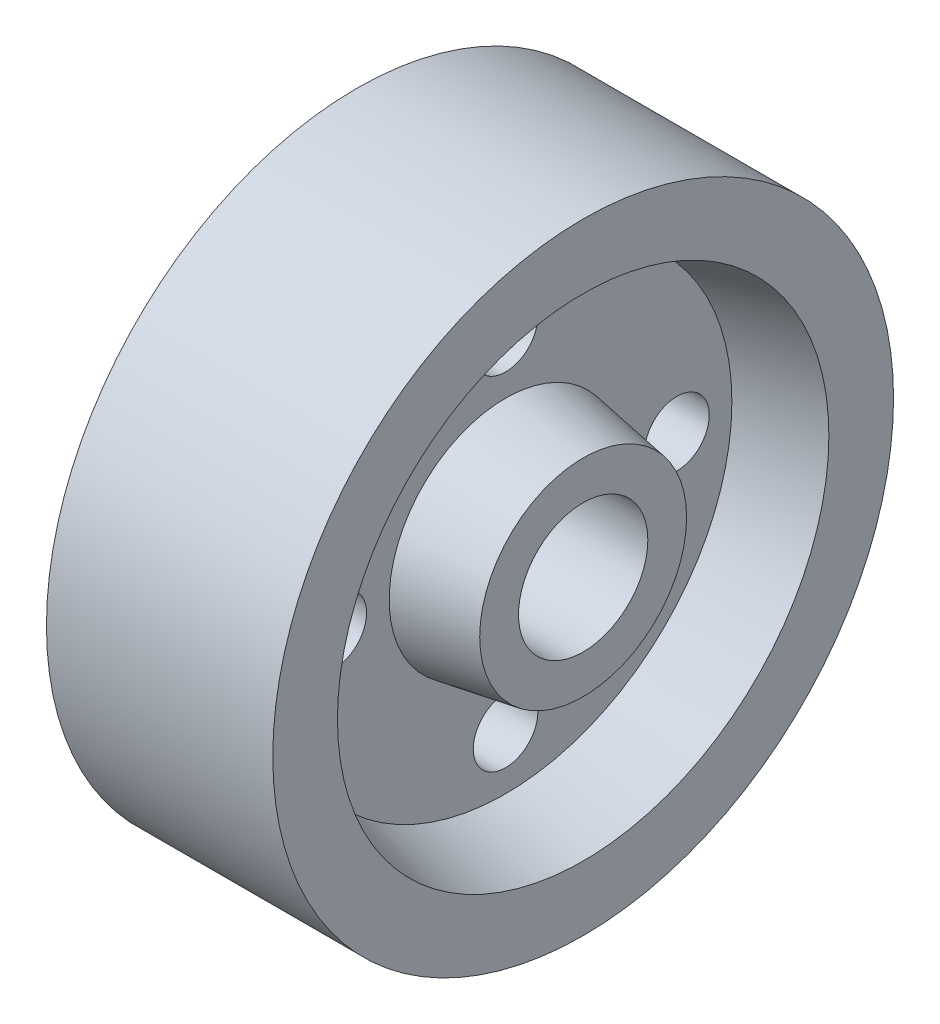
ISO-10303-21;
HEADER;
FILE_DESCRIPTION(('STEP AP214'),'2;1');
FILE_NAME('part.step','',(''),(''),'','','');
FILE_SCHEMA(('AUTOMOTIVE_DESIGN { 1 0 10303 214 1 1 1 1 }'));
ENDSEC;
DATA;
#1=APPLICATION_CONTEXT('core data for automotive mechanical design processes');
#2=APPLICATION_PROTOCOL_DEFINITION('international standard','automotive_design',2000,#1);
#3=PRODUCT_CONTEXT('',#1,'mechanical');
#4=PRODUCT('Part','Part','',(#3));
#5=PRODUCT_RELATED_PRODUCT_CATEGORY('part','',(#4));
#6=PRODUCT_DEFINITION_FORMATION('','',#4);
#7=PRODUCT_DEFINITION_CONTEXT('part definition',#1,'design');
#8=PRODUCT_DEFINITION('design','',#6,#7);
#9=PRODUCT_DEFINITION_SHAPE('','',#8);
#10=(LENGTH_UNIT() NAMED_UNIT(*) SI_UNIT(.MILLI.,.METRE.));
#11=(NAMED_UNIT(*) PLANE_ANGLE_UNIT() SI_UNIT($,.RADIAN.));
#12=(NAMED_UNIT(*) SI_UNIT($,.STERADIAN.) SOLID_ANGLE_UNIT());
#13=UNCERTAINTY_MEASURE_WITH_UNIT(LENGTH_MEASURE(1.E-05),#10,'distance_accuracy_value','');
#14=(GEOMETRIC_REPRESENTATION_CONTEXT(3) GLOBAL_UNCERTAINTY_ASSIGNED_CONTEXT((#13)) GLOBAL_UNIT_ASSIGNED_CONTEXT((#10,
#11,#12)) REPRESENTATION_CONTEXT('',''));
#15=CARTESIAN_POINT('',(0.,0.,0.));
#16=DIRECTION('',(0.,0.,1.));
#17=DIRECTION('',(1.,0.,0.));
#18=AXIS2_PLACEMENT_3D('',#15,#16,#17);
#19=CARTESIAN_POINT('',(-12.,10.,0.));
#20=DIRECTION('',(-1.,0.,0.));
#21=DIRECTION('',(0.,0.,1.));
#22=AXIS2_PLACEMENT_3D('',#19,#20,#21);
#23=PLANE('',#22);
#24=CARTESIAN_POINT('',(-12.,0.,0.));
#25=DIRECTION('',(1.,0.,0.));
#26=DIRECTION('',(0.,0.,-1.));
#27=AXIS2_PLACEMENT_3D('',#24,#25,#26);
#28=CIRCLE('',#27,10.);
#29=CARTESIAN_POINT('',(-12.,0.,-10.));
#30=VERTEX_POINT('',#29);
#31=EDGE_CURVE('E10',#30,#30,#28,.T.);
#32=ORIENTED_EDGE('',*,*,#31,.T.);
#33=EDGE_LOOP('',(#32));
#34=FACE_BOUND('',#33,.T.);
#35=CARTESIAN_POINT('',(-12.,0.,0.));
#36=DIRECTION('',(1.,0.,0.));
#37=DIRECTION('',(0.,0.,-1.));
#38=AXIS2_PLACEMENT_3D('',#35,#36,#37);
#39=CIRCLE('',#38,16.);
#40=CARTESIAN_POINT('',(-12.,0.,-16.));
#41=VERTEX_POINT('',#40);
#42=EDGE_CURVE('E51',#41,#41,#39,.T.);
#43=ORIENTED_EDGE('',*,*,#42,.F.);
#44=EDGE_LOOP('',(#43));
#45=FACE_BOUND('',#44,.T.);
#46=ADVANCED_FACE('F43',(#34,#45),#23,.T.);
#47=CARTESIAN_POINT('',(0.,0.,0.));
#48=DIRECTION('',(1.,0.,0.));
#49=DIRECTION('',(0.,0.,-1.));
#50=AXIS2_PLACEMENT_3D('',#47,#48,#49);
#51=CONICAL_SURFACE('',#50,18.,0.165148677414627);
#52=ORIENTED_EDGE('',*,*,#42,.T.);
#53=EDGE_LOOP('',(#52));
#54=FACE_BOUND('',#53,.T.);
#55=CARTESIAN_POINT('',(0.,0.,0.));
#56=DIRECTION('',(1.,0.,0.));
#57=DIRECTION('',(0.,0.,-1.));
#58=AXIS2_PLACEMENT_3D('',#55,#56,#57);
#59=CIRCLE('',#58,18.);
#60=CARTESIAN_POINT('',(0.,0.,-18.));
#61=VERTEX_POINT('',#60);
#62=EDGE_CURVE('E57',#61,#61,#59,.T.);
#63=ORIENTED_EDGE('',*,*,#62,.F.);
#64=EDGE_LOOP('',(#63));
#65=FACE_BOUND('',#64,.T.);
#66=ADVANCED_FACE('F132',(#54,#65),#51,.T.);
#67=CARTESIAN_POINT('',(0.,18.,0.));
#68=DIRECTION('',(-1.,0.,0.));
#69=DIRECTION('',(0.,0.,1.));
#70=AXIS2_PLACEMENT_3D('',#67,#68,#69);
#71=PLANE('',#70);
#72=CARTESIAN_POINT('',(0.,26.5,0.));
#73=DIRECTION('',(-1.,0.,0.));
#74=DIRECTION('',(0.,0.,1.));
#75=AXIS2_PLACEMENT_3D('',#72,#73,#74);
#76=CIRCLE('',#75,5.);
#77=CARTESIAN_POINT('',(0.,26.5,5.));
#78=VERTEX_POINT('',#77);
#79=EDGE_CURVE('E86',#78,#78,#76,.T.);
#80=ORIENTED_EDGE('',*,*,#79,.F.);
#81=EDGE_LOOP('',(#80));
#82=FACE_BOUND('',#81,.T.);
#83=CARTESIAN_POINT('',(0.,0.,26.5));
#84=DIRECTION('',(-1.,0.,0.));
#85=DIRECTION('',(0.,0.,1.));
#86=AXIS2_PLACEMENT_3D('',#83,#84,#85);
#87=CIRCLE('',#86,5.);
#88=CARTESIAN_POINT('',(0.,0.,31.5));
#89=VERTEX_POINT('',#88);
#90=EDGE_CURVE('E73',#89,#89,#87,.T.);
#91=ORIENTED_EDGE('',*,*,#90,.F.);
#92=EDGE_LOOP('',(#91));
#93=FACE_BOUND('',#92,.T.);
#94=CARTESIAN_POINT('',(0.,-26.5,-1.85048510958686E-13));
#95=DIRECTION('',(-1.,0.,0.));
#96=DIRECTION('',(0.,0.,1.));
#97=AXIS2_PLACEMENT_3D('',#94,#95,#96);
#98=CIRCLE('',#97,5.);
#99=CARTESIAN_POINT('',(0.,-26.5,4.99999999999982));
#100=VERTEX_POINT('',#99);
#101=EDGE_CURVE('E69',#100,#100,#98,.T.);
#102=ORIENTED_EDGE('',*,*,#101,.F.);
#103=EDGE_LOOP('',(#102));
#104=FACE_BOUND('',#103,.T.);
#105=CARTESIAN_POINT('',(0.,2.77572766438029E-13,-26.5));
#106=DIRECTION('',(-1.,0.,0.));
#107=DIRECTION('',(0.,0.,1.));
#108=AXIS2_PLACEMENT_3D('',#105,#106,#107);
#109=CIRCLE('',#108,5.);
#110=CARTESIAN_POINT('',(0.,2.77572766438029E-13,-21.5));
#111=VERTEX_POINT('',#110);
#112=EDGE_CURVE('E65',#111,#111,#109,.T.);
#113=ORIENTED_EDGE('',*,*,#112,.F.);
#114=EDGE_LOOP('',(#113));
#115=FACE_BOUND('',#114,.T.);
#116=ORIENTED_EDGE('',*,*,#62,.T.);
#117=EDGE_LOOP('',(#116));
#118=FACE_BOUND('',#117,.T.);
#119=CARTESIAN_POINT('',(0.,0.,0.));
#120=DIRECTION('',(1.,0.,0.));
#121=DIRECTION('',(0.,0.,-1.));
#122=AXIS2_PLACEMENT_3D('',#119,#120,#121);
#123=CIRCLE('',#122,35.);
#124=CARTESIAN_POINT('',(0.,0.,-35.));
#125=VERTEX_POINT('',#124);
#126=EDGE_CURVE('E122',#125,#125,#123,.T.);
#127=ORIENTED_EDGE('',*,*,#126,.F.);
#128=EDGE_LOOP('',(#127));
#129=FACE_BOUND('',#128,.T.);
#130=ADVANCED_FACE('F129',(#82,#93,#104,#115,#118,#129),#71,.T.);
#131=CARTESIAN_POINT('',(-12.,0.,0.));
#132=DIRECTION('',(-1.,0.,0.));
#133=DIRECTION('',(0.,0.,1.));
#134=AXIS2_PLACEMENT_3D('',#131,#132,#133);
#135=CONICAL_SURFACE('',#134,38.,0.244978663126863);
#136=ORIENTED_EDGE('',*,*,#126,.T.);
#137=EDGE_LOOP('',(#136));
#138=FACE_BOUND('',#137,.T.);
#139=CARTESIAN_POINT('',(-12.,0.,0.));
#140=DIRECTION('',(1.,0.,0.));
#141=DIRECTION('',(0.,0.,-1.));
#142=AXIS2_PLACEMENT_3D('',#139,#140,#141);
#143=CIRCLE('',#142,38.);
#144=CARTESIAN_POINT('',(-12.,0.,-38.));
#145=VERTEX_POINT('',#144);
#146=EDGE_CURVE('E118',#145,#145,#143,.T.);
#147=ORIENTED_EDGE('',*,*,#146,.F.);
#148=EDGE_LOOP('',(#147));
#149=FACE_BOUND('',#148,.T.);
#150=ADVANCED_FACE('F140',(#138,#149),#135,.F.);
#151=CARTESIAN_POINT('',(-12.,38.,0.));
#152=DIRECTION('',(-1.,0.,0.));
#153=DIRECTION('',(0.,0.,1.));
#154=AXIS2_PLACEMENT_3D('',#151,#152,#153);
#155=PLANE('',#154);
#156=ORIENTED_EDGE('',*,*,#146,.T.);
#157=EDGE_LOOP('',(#156));
#158=FACE_BOUND('',#157,.T.);
#159=CARTESIAN_POINT('',(-12.,0.,0.));
#160=DIRECTION('',(1.,0.,0.));
#161=DIRECTION('',(0.,0.,-1.));
#162=AXIS2_PLACEMENT_3D('',#159,#160,#161);
#163=CIRCLE('',#162,48.);
#164=CARTESIAN_POINT('',(-12.,0.,-48.));
#165=VERTEX_POINT('',#164);
#166=EDGE_CURVE('E114',#165,#165,#163,.T.);
#167=ORIENTED_EDGE('',*,*,#166,.F.);
#168=EDGE_LOOP('',(#167));
#169=FACE_BOUND('',#168,.T.);
#170=ADVANCED_FACE('F145',(#158,#169),#155,.T.);
#171=CARTESIAN_POINT('',(11.,0.,0.));
#172=DIRECTION('',(1.,0.,0.));
#173=DIRECTION('',(0.,0.,-1.));
#174=AXIS2_PLACEMENT_3D('',#171,#172,#173);
#175=CYLINDRICAL_SURFACE('',#174,48.);
#176=ORIENTED_EDGE('',*,*,#166,.T.);
#177=EDGE_LOOP('',(#176));
#178=FACE_BOUND('',#177,.T.);
#179=CARTESIAN_POINT('',(23.,0.,0.));
#180=DIRECTION('',(1.,0.,0.));
#181=DIRECTION('',(0.,0.,-1.));
#182=AXIS2_PLACEMENT_3D('',#179,#180,#181);
#183=CIRCLE('',#182,48.);
#184=CARTESIAN_POINT('',(23.,0.,-48.));
#185=VERTEX_POINT('',#184);
#186=EDGE_CURVE('E110',#185,#185,#183,.T.);
#187=ORIENTED_EDGE('',*,*,#186,.F.);
#188=EDGE_LOOP('',(#187));
#189=FACE_BOUND('',#188,.T.);
#190=ADVANCED_FACE('F149',(#178,#189),#175,.T.);
#191=CARTESIAN_POINT('',(23.,48.,0.));
#192=DIRECTION('',(1.,0.,0.));
#193=DIRECTION('',(0.,0.,-1.));
#194=AXIS2_PLACEMENT_3D('',#191,#192,#193);
#195=PLANE('',#194);
#196=ORIENTED_EDGE('',*,*,#186,.T.);
#197=EDGE_LOOP('',(#196));
#198=FACE_BOUND('',#197,.T.);
#199=CARTESIAN_POINT('',(23.,0.,0.));
#200=DIRECTION('',(1.,0.,0.));
#201=DIRECTION('',(0.,0.,-1.));
#202=AXIS2_PLACEMENT_3D('',#199,#200,#201);
#203=CIRCLE('',#202,38.);
#204=CARTESIAN_POINT('',(23.,0.,-38.));
#205=VERTEX_POINT('',#204);
#206=EDGE_CURVE('E106',#205,#205,#203,.T.);
#207=ORIENTED_EDGE('',*,*,#206,.F.);
#208=EDGE_LOOP('',(#207));
#209=FACE_BOUND('',#208,.T.);
#210=ADVANCED_FACE('F153',(#198,#209),#195,.T.);
#211=CARTESIAN_POINT('',(11.,0.,0.));
#212=DIRECTION('',(1.,0.,0.));
#213=DIRECTION('',(0.,0.,-1.));
#214=AXIS2_PLACEMENT_3D('',#211,#212,#213);
#215=CONICAL_SURFACE('',#214,35.,0.244978663126863);
#216=ORIENTED_EDGE('',*,*,#206,.T.);
#217=EDGE_LOOP('',(#216));
#218=FACE_BOUND('',#217,.T.);
#219=CARTESIAN_POINT('',(11.,0.,0.));
#220=DIRECTION('',(1.,0.,0.));
#221=DIRECTION('',(0.,0.,-1.));
#222=AXIS2_PLACEMENT_3D('',#219,#220,#221);
#223=CIRCLE('',#222,35.);
#224=CARTESIAN_POINT('',(11.,0.,-35.));
#225=VERTEX_POINT('',#224);
#226=EDGE_CURVE('E102',#225,#225,#223,.T.);
#227=ORIENTED_EDGE('',*,*,#226,.F.);
#228=EDGE_LOOP('',(#227));
#229=FACE_BOUND('',#228,.T.);
#230=ADVANCED_FACE('F157',(#218,#229),#215,.F.);
#231=CARTESIAN_POINT('',(11.,35.,0.));
#232=DIRECTION('',(1.,0.,0.));
#233=DIRECTION('',(0.,0.,-1.));
#234=AXIS2_PLACEMENT_3D('',#231,#232,#233);
#235=PLANE('',#234);
#236=CARTESIAN_POINT('',(11.,26.5,0.));
#237=DIRECTION('',(1.,0.,0.));
#238=DIRECTION('',(0.,0.,-1.));
#239=AXIS2_PLACEMENT_3D('',#236,#237,#238);
#240=CIRCLE('',#239,5.);
#241=CARTESIAN_POINT('',(11.,26.5,-5.));
#242=VERTEX_POINT('',#241);
#243=EDGE_CURVE('E46',#242,#242,#240,.T.);
#244=ORIENTED_EDGE('',*,*,#243,.F.);
#245=EDGE_LOOP('',(#244));
#246=FACE_BOUND('',#245,.T.);
#247=CARTESIAN_POINT('',(11.,0.,26.5));
#248=DIRECTION('',(1.,0.,0.));
#249=DIRECTION('',(0.,0.,-1.));
#250=AXIS2_PLACEMENT_3D('',#247,#248,#249);
#251=CIRCLE('',#250,5.);
#252=CARTESIAN_POINT('',(11.,0.,21.5));
#253=VERTEX_POINT('',#252);
#254=EDGE_CURVE('E70',#253,#253,#251,.T.);
#255=ORIENTED_EDGE('',*,*,#254,.F.);
#256=EDGE_LOOP('',(#255));
#257=FACE_BOUND('',#256,.T.);
#258=CARTESIAN_POINT('',(11.,-26.5,-1.85048510958686E-13));
#259=DIRECTION('',(1.,0.,0.));
#260=DIRECTION('',(0.,0.,-1.));
#261=AXIS2_PLACEMENT_3D('',#258,#259,#260);
#262=CIRCLE('',#261,5.);
#263=CARTESIAN_POINT('',(11.,-26.5,-5.00000000000019));
#264=VERTEX_POINT('',#263);
#265=EDGE_CURVE('E66',#264,#264,#262,.T.);
#266=ORIENTED_EDGE('',*,*,#265,.F.);
#267=EDGE_LOOP('',(#266));
#268=FACE_BOUND('',#267,.T.);
#269=CARTESIAN_POINT('',(11.,2.77572766438029E-13,-26.5));
#270=DIRECTION('',(1.,0.,0.));
#271=DIRECTION('',(0.,0.,-1.));
#272=AXIS2_PLACEMENT_3D('',#269,#270,#271);
#273=CIRCLE('',#272,5.);
#274=CARTESIAN_POINT('',(11.,2.77572766438029E-13,-31.5));
#275=VERTEX_POINT('',#274);
#276=EDGE_CURVE('E61',#275,#275,#273,.T.);
#277=ORIENTED_EDGE('',*,*,#276,.F.);
#278=EDGE_LOOP('',(#277));
#279=FACE_BOUND('',#278,.T.);
#280=ORIENTED_EDGE('',*,*,#226,.T.);
#281=EDGE_LOOP('',(#280));
#282=FACE_BOUND('',#281,.T.);
#283=CARTESIAN_POINT('',(11.,0.,0.));
#284=DIRECTION('',(1.,0.,0.));
#285=DIRECTION('',(0.,0.,-1.));
#286=AXIS2_PLACEMENT_3D('',#283,#284,#285);
#287=CIRCLE('',#286,18.);
#288=CARTESIAN_POINT('',(11.,0.,-18.));
#289=VERTEX_POINT('',#288);
#290=EDGE_CURVE('E98',#289,#289,#287,.T.);
#291=ORIENTED_EDGE('',*,*,#290,.F.);
#292=EDGE_LOOP('',(#291));
#293=FACE_BOUND('',#292,.T.);
#294=ADVANCED_FACE('F161',(#246,#257,#268,#279,#282,#293),#235,.T.);
#295=CARTESIAN_POINT('',(23.,0.,0.));
#296=DIRECTION('',(-1.,0.,0.));
#297=DIRECTION('',(0.,0.,1.));
#298=AXIS2_PLACEMENT_3D('',#295,#296,#297);
#299=CONICAL_SURFACE('',#298,16.,0.165148677414627);
#300=ORIENTED_EDGE('',*,*,#290,.T.);
#301=EDGE_LOOP('',(#300));
#302=FACE_BOUND('',#301,.T.);
#303=CARTESIAN_POINT('',(23.,0.,0.));
#304=DIRECTION('',(1.,0.,0.));
#305=DIRECTION('',(0.,0.,-1.));
#306=AXIS2_PLACEMENT_3D('',#303,#304,#305);
#307=CIRCLE('',#306,16.);
#308=CARTESIAN_POINT('',(23.,0.,-16.));
#309=VERTEX_POINT('',#308);
#310=EDGE_CURVE('E94',#309,#309,#307,.T.);
#311=ORIENTED_EDGE('',*,*,#310,.F.);
#312=EDGE_LOOP('',(#311));
#313=FACE_BOUND('',#312,.T.);
#314=ADVANCED_FACE('F165',(#302,#313),#299,.T.);
#315=CARTESIAN_POINT('',(23.,10.,0.));
#316=DIRECTION('',(1.,0.,0.));
#317=DIRECTION('',(0.,0.,-1.));
#318=AXIS2_PLACEMENT_3D('',#315,#316,#317);
#319=PLANE('',#318);
#320=ORIENTED_EDGE('',*,*,#310,.T.);
#321=EDGE_LOOP('',(#320));
#322=FACE_BOUND('',#321,.T.);
#323=CARTESIAN_POINT('',(23.,0.,0.));
#324=DIRECTION('',(1.,0.,0.));
#325=DIRECTION('',(0.,0.,-1.));
#326=AXIS2_PLACEMENT_3D('',#323,#324,#325);
#327=CIRCLE('',#326,10.);
#328=CARTESIAN_POINT('',(23.,0.,-10.));
#329=VERTEX_POINT('',#328);
#330=EDGE_CURVE('E90',#329,#329,#327,.T.);
#331=ORIENTED_EDGE('',*,*,#330,.F.);
#332=EDGE_LOOP('',(#331));
#333=FACE_BOUND('',#332,.T.);
#334=ADVANCED_FACE('F169',(#322,#333),#319,.T.);
#335=CARTESIAN_POINT('',(11.,0.,0.));
#336=DIRECTION('',(1.,0.,0.));
#337=DIRECTION('',(0.,0.,-1.));
#338=AXIS2_PLACEMENT_3D('',#335,#336,#337);
#339=CYLINDRICAL_SURFACE('',#338,10.);
#340=ORIENTED_EDGE('',*,*,#330,.T.);
#341=EDGE_LOOP('',(#340));
#342=FACE_BOUND('',#341,.T.);
#343=ORIENTED_EDGE('',*,*,#31,.F.);
#344=EDGE_LOOP('',(#343));
#345=FACE_BOUND('',#344,.T.);
#346=ADVANCED_FACE('F173',(#342,#345),#339,.F.);
#347=CARTESIAN_POINT('',(28.72,2.77572766438029E-13,-26.5));
#348=DIRECTION('',(-1.,0.,0.));
#349=DIRECTION('',(0.,0.,1.));
#350=AXIS2_PLACEMENT_3D('',#347,#348,#349);
#351=CYLINDRICAL_SURFACE('',#350,5.);
#352=ORIENTED_EDGE('',*,*,#112,.T.);
#353=EDGE_LOOP('',(#352));
#354=FACE_BOUND('',#353,.T.);
#355=ORIENTED_EDGE('',*,*,#276,.T.);
#356=EDGE_LOOP('',(#355));
#357=FACE_BOUND('',#356,.T.);
#358=ADVANCED_FACE('F177',(#354,#357),#351,.F.);
#359=CARTESIAN_POINT('',(28.72,-26.5,-1.85048510958686E-13));
#360=DIRECTION('',(-1.,0.,0.));
#361=DIRECTION('',(0.,0.,1.));
#362=AXIS2_PLACEMENT_3D('',#359,#360,#361);
#363=CYLINDRICAL_SURFACE('',#362,5.);
#364=ORIENTED_EDGE('',*,*,#101,.T.);
#365=EDGE_LOOP('',(#364));
#366=FACE_BOUND('',#365,.T.);
#367=ORIENTED_EDGE('',*,*,#265,.T.);
#368=EDGE_LOOP('',(#367));
#369=FACE_BOUND('',#368,.T.);
#370=ADVANCED_FACE('F181',(#366,#369),#363,.F.);
#371=CARTESIAN_POINT('',(28.72,0.,26.5));
#372=DIRECTION('',(-1.,0.,0.));
#373=DIRECTION('',(0.,0.,1.));
#374=AXIS2_PLACEMENT_3D('',#371,#372,#373);
#375=CYLINDRICAL_SURFACE('',#374,5.);
#376=ORIENTED_EDGE('',*,*,#90,.T.);
#377=EDGE_LOOP('',(#376));
#378=FACE_BOUND('',#377,.T.);
#379=ORIENTED_EDGE('',*,*,#254,.T.);
#380=EDGE_LOOP('',(#379));
#381=FACE_BOUND('',#380,.T.);
#382=ADVANCED_FACE('F185',(#378,#381),#375,.F.);
#383=CARTESIAN_POINT('',(28.72,26.5,0.));
#384=DIRECTION('',(-1.,0.,0.));
#385=DIRECTION('',(0.,0.,1.));
#386=AXIS2_PLACEMENT_3D('',#383,#384,#385);
#387=CYLINDRICAL_SURFACE('',#386,5.);
#388=ORIENTED_EDGE('',*,*,#79,.T.);
#389=EDGE_LOOP('',(#388));
#390=FACE_BOUND('',#389,.T.);
#391=ORIENTED_EDGE('',*,*,#243,.T.);
#392=EDGE_LOOP('',(#391));
#393=FACE_BOUND('',#392,.T.);
#394=ADVANCED_FACE('F188',(#390,#393),#387,.F.);
#395=CLOSED_SHELL('',(#46,#66,#130,#150,#170,#190,#210,#230,#294,#314,#334,#346,#358,#370,#382,#394));
#396=MANIFOLD_SOLID_BREP('B2',#395);
#397=ADVANCED_BREP_SHAPE_REPRESENTATION('',(#18,#396),#14);
#398=SHAPE_DEFINITION_REPRESENTATION(#9,#397);
ENDSEC;
END-ISO-10303-21;
